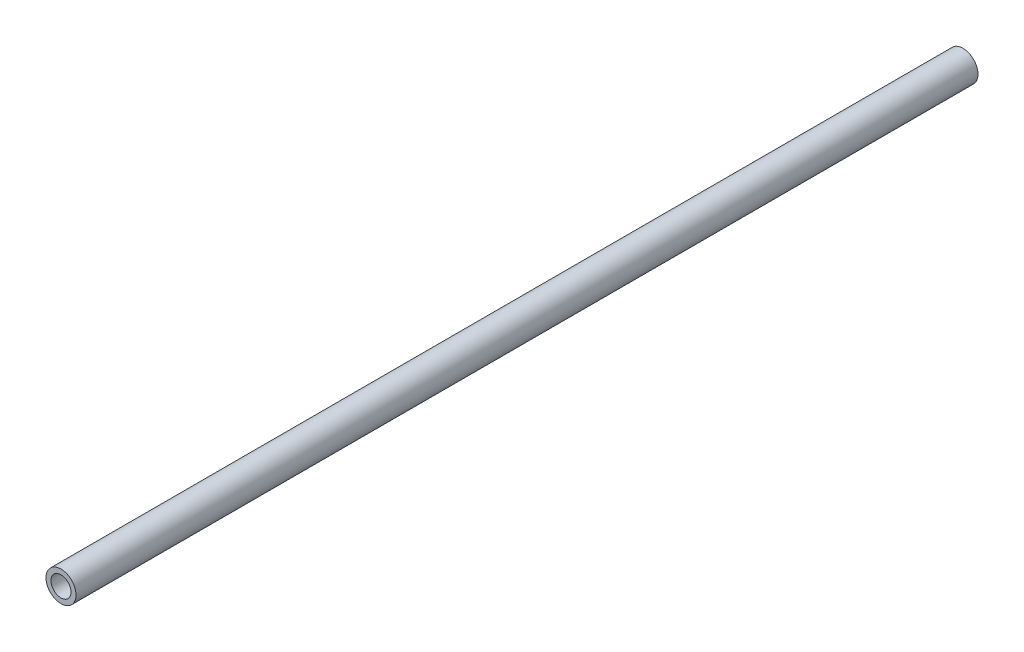
ISO-10303-21;
HEADER;
FILE_DESCRIPTION(('STEP AP214'),'2;1');
FILE_NAME('part.step','',(''),(''),'','','');
FILE_SCHEMA(('AUTOMOTIVE_DESIGN { 1 0 10303 214 1 1 1 1 }'));
ENDSEC;
DATA;
#1=APPLICATION_CONTEXT('core data for automotive mechanical design processes');
#2=APPLICATION_PROTOCOL_DEFINITION('international standard','automotive_design',2000,#1);
#3=PRODUCT_CONTEXT('',#1,'mechanical');
#4=PRODUCT('Part','Part','',(#3));
#5=PRODUCT_RELATED_PRODUCT_CATEGORY('part','',(#4));
#6=PRODUCT_DEFINITION_FORMATION('','',#4);
#7=PRODUCT_DEFINITION_CONTEXT('part definition',#1,'design');
#8=PRODUCT_DEFINITION('design','',#6,#7);
#9=PRODUCT_DEFINITION_SHAPE('','',#8);
#10=(LENGTH_UNIT() NAMED_UNIT(*) SI_UNIT(.MILLI.,.METRE.));
#11=(NAMED_UNIT(*) PLANE_ANGLE_UNIT() SI_UNIT($,.RADIAN.));
#12=(NAMED_UNIT(*) SI_UNIT($,.STERADIAN.) SOLID_ANGLE_UNIT());
#13=UNCERTAINTY_MEASURE_WITH_UNIT(LENGTH_MEASURE(1.E-05),#10,'distance_accuracy_value','');
#14=(GEOMETRIC_REPRESENTATION_CONTEXT(3) GLOBAL_UNCERTAINTY_ASSIGNED_CONTEXT((#13)) GLOBAL_UNIT_ASSIGNED_CONTEXT((#10,
#11,#12)) REPRESENTATION_CONTEXT('',''));
#15=CARTESIAN_POINT('',(0.,0.,0.));
#16=DIRECTION('',(0.,0.,1.));
#17=DIRECTION('',(1.,0.,0.));
#18=AXIS2_PLACEMENT_3D('',#15,#16,#17);
#19=CARTESIAN_POINT('',(0.,0.,180.18));
#20=DIRECTION('',(0.,0.,1.));
#21=DIRECTION('',(1.,0.,0.));
#22=AXIS2_PLACEMENT_3D('',#19,#20,#21);
#23=PLANE('',#22);
#24=CARTESIAN_POINT('',(0.,0.,180.18));
#25=DIRECTION('',(0.,0.,1.));
#26=DIRECTION('',(1.,0.,0.));
#27=AXIS2_PLACEMENT_3D('',#24,#25,#26);
#28=CIRCLE('',#27,3.);
#29=CARTESIAN_POINT('',(3.,0.,180.18));
#30=VERTEX_POINT('',#29);
#31=EDGE_CURVE('E10',#30,#30,#28,.T.);
#32=ORIENTED_EDGE('',*,*,#31,.T.);
#33=EDGE_LOOP('',(#32));
#34=FACE_BOUND('',#33,.T.);
#35=CARTESIAN_POINT('',(0.,0.,180.18));
#36=DIRECTION('',(0.,0.,1.));
#37=DIRECTION('',(1.,0.,0.));
#38=AXIS2_PLACEMENT_3D('',#35,#36,#37);
#39=CIRCLE('',#38,2.);
#40=CARTESIAN_POINT('',(2.,0.,180.18));
#41=VERTEX_POINT('',#40);
#42=EDGE_CURVE('E42',#41,#41,#39,.T.);
#43=ORIENTED_EDGE('',*,*,#42,.F.);
#44=EDGE_LOOP('',(#43));
#45=FACE_BOUND('',#44,.T.);
#46=ADVANCED_FACE('F31',(#34,#45),#23,.T.);
#47=CARTESIAN_POINT('',(0.,0.,0.));
#48=DIRECTION('',(0.,0.,1.));
#49=DIRECTION('',(1.,0.,0.));
#50=AXIS2_PLACEMENT_3D('',#47,#48,#49);
#51=PLANE('',#50);
#52=CARTESIAN_POINT('',(0.,0.,0.));
#53=DIRECTION('',(0.,0.,1.));
#54=DIRECTION('',(1.,0.,0.));
#55=AXIS2_PLACEMENT_3D('',#52,#53,#54);
#56=CIRCLE('',#55,3.);
#57=CARTESIAN_POINT('',(3.,0.,0.));
#58=VERTEX_POINT('',#57);
#59=EDGE_CURVE('E35',#58,#58,#56,.T.);
#60=ORIENTED_EDGE('',*,*,#59,.F.);
#61=EDGE_LOOP('',(#60));
#62=FACE_BOUND('',#61,.T.);
#63=CARTESIAN_POINT('',(0.,0.,0.));
#64=DIRECTION('',(0.,0.,1.));
#65=DIRECTION('',(1.,0.,0.));
#66=AXIS2_PLACEMENT_3D('',#63,#64,#65);
#67=CIRCLE('',#66,2.);
#68=CARTESIAN_POINT('',(2.,0.,0.));
#69=VERTEX_POINT('',#68);
#70=EDGE_CURVE('E44',#69,#69,#67,.T.);
#71=ORIENTED_EDGE('',*,*,#70,.T.);
#72=EDGE_LOOP('',(#71));
#73=FACE_BOUND('',#72,.T.);
#74=ADVANCED_FACE('F54',(#62,#73),#51,.F.);
#75=CARTESIAN_POINT('',(0.,0.,180.18));
#76=DIRECTION('',(0.,0.,-1.));
#77=DIRECTION('',(-1.,0.,0.));
#78=AXIS2_PLACEMENT_3D('',#75,#76,#77);
#79=CYLINDRICAL_SURFACE('',#78,3.);
#80=ORIENTED_EDGE('',*,*,#31,.F.);
#81=EDGE_LOOP('',(#80));
#82=FACE_BOUND('',#81,.T.);
#83=ORIENTED_EDGE('',*,*,#59,.T.);
#84=EDGE_LOOP('',(#83));
#85=FACE_BOUND('',#84,.T.);
#86=ADVANCED_FACE('F33',(#82,#85),#79,.T.);
#87=CARTESIAN_POINT('',(0.,0.,180.18));
#88=DIRECTION('',(0.,0.,-1.));
#89=DIRECTION('',(-1.,0.,0.));
#90=AXIS2_PLACEMENT_3D('',#87,#88,#89);
#91=CYLINDRICAL_SURFACE('',#90,2.);
#92=ORIENTED_EDGE('',*,*,#42,.T.);
#93=EDGE_LOOP('',(#92));
#94=FACE_BOUND('',#93,.T.);
#95=ORIENTED_EDGE('',*,*,#70,.F.);
#96=EDGE_LOOP('',(#95));
#97=FACE_BOUND('',#96,.T.);
#98=ADVANCED_FACE('F50',(#94,#97),#91,.F.);
#99=CLOSED_SHELL('',(#46,#74,#86,#98));
#100=MANIFOLD_SOLID_BREP('B2',#99);
#101=ADVANCED_BREP_SHAPE_REPRESENTATION('',(#18,#100),#14);
#102=SHAPE_DEFINITION_REPRESENTATION(#9,#101);
ENDSEC;
END-ISO-10303-21;
